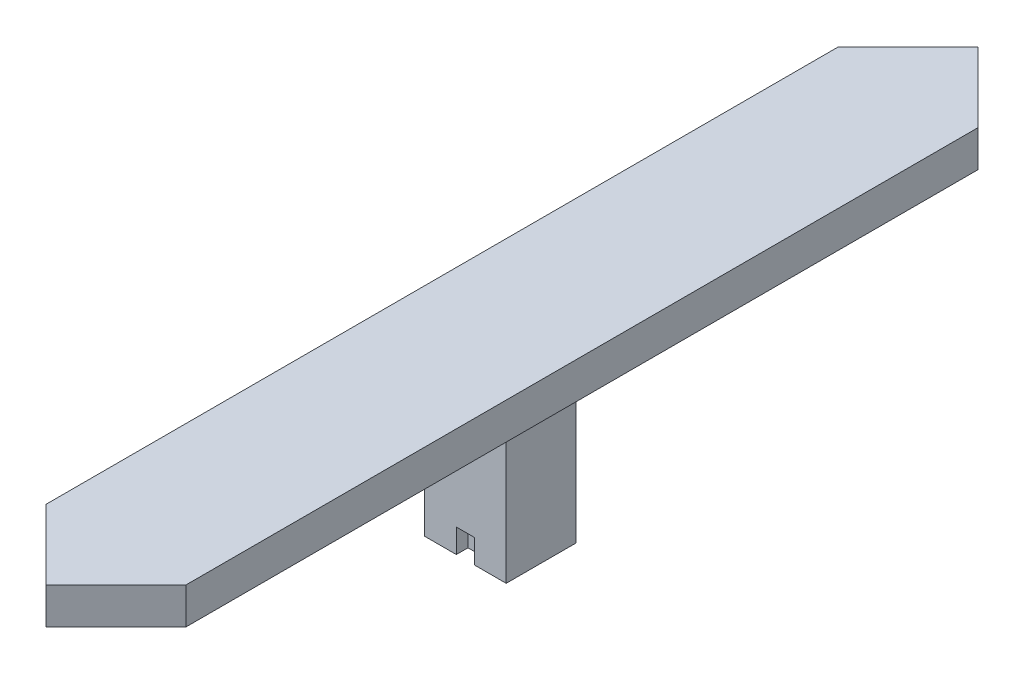
ISO-10303-21;
HEADER;
FILE_DESCRIPTION(('STEP AP214'),'2;1');
FILE_NAME('part.step','',(''),(''),'','','');
FILE_SCHEMA(('AUTOMOTIVE_DESIGN { 1 0 10303 214 1 1 1 1 }'));
ENDSEC;
DATA;
#1=APPLICATION_CONTEXT('core data for automotive mechanical design processes');
#2=APPLICATION_PROTOCOL_DEFINITION('international standard','automotive_design',2000,#1);
#3=PRODUCT_CONTEXT('',#1,'mechanical');
#4=PRODUCT('Part','Part','',(#3));
#5=PRODUCT_RELATED_PRODUCT_CATEGORY('part','',(#4));
#6=PRODUCT_DEFINITION_FORMATION('','',#4);
#7=PRODUCT_DEFINITION_CONTEXT('part definition',#1,'design');
#8=PRODUCT_DEFINITION('design','',#6,#7);
#9=PRODUCT_DEFINITION_SHAPE('','',#8);
#10=(LENGTH_UNIT() NAMED_UNIT(*) SI_UNIT(.MILLI.,.METRE.));
#11=(NAMED_UNIT(*) PLANE_ANGLE_UNIT() SI_UNIT($,.RADIAN.));
#12=(NAMED_UNIT(*) SI_UNIT($,.STERADIAN.) SOLID_ANGLE_UNIT());
#13=UNCERTAINTY_MEASURE_WITH_UNIT(LENGTH_MEASURE(1.E-05),#10,'distance_accuracy_value','');
#14=(GEOMETRIC_REPRESENTATION_CONTEXT(3) GLOBAL_UNCERTAINTY_ASSIGNED_CONTEXT((#13)) GLOBAL_UNIT_ASSIGNED_CONTEXT((#10,
#11,#12)) REPRESENTATION_CONTEXT('',''));
#15=CARTESIAN_POINT('',(0.,0.,0.));
#16=DIRECTION('',(0.,0.,1.));
#17=DIRECTION('',(1.,0.,0.));
#18=AXIS2_PLACEMENT_3D('',#15,#16,#17);
#19=CARTESIAN_POINT('',(0.,0.,0.));
#20=DIRECTION('',(0.,1.,0.));
#21=DIRECTION('',(0.,0.,1.));
#22=AXIS2_PLACEMENT_3D('',#19,#20,#21);
#23=PLANE('',#22);
#24=DIRECTION('',(-0.70710678118655,0.,0.707106781186545));
#25=VECTOR('',#24,1.);
#26=CARTESIAN_POINT('',(0.,0.,0.));
#27=LINE('',#26,#25);
#28=CARTESIAN_POINT('',(0.,0.,0.));
#29=VERTEX_POINT('',#28);
#30=CARTESIAN_POINT('',(-6.,0.,5.99999999999997));
#31=VERTEX_POINT('',#30);
#32=EDGE_CURVE('E246',#29,#31,#27,.T.);
#33=ORIENTED_EDGE('',*,*,#32,.F.);
#34=DIRECTION('',(-0.707106781186549,0.,-0.707106781186546));
#35=VECTOR('',#34,1.);
#36=CARTESIAN_POINT('',(0.,0.,0.));
#37=LINE('',#36,#35);
#38=CARTESIAN_POINT('',(6.,0.,5.99999999999996));
#39=VERTEX_POINT('',#38);
#40=EDGE_CURVE('E251',#39,#29,#37,.T.);
#41=ORIENTED_EDGE('',*,*,#40,.F.);
#42=DIRECTION('',(0.,0.,-1.));
#43=VECTOR('',#42,1.);
#44=CARTESIAN_POINT('',(6.,0.,5.99999999999996));
#45=LINE('',#44,#43);
#46=CARTESIAN_POINT('',(6.00000000000001,0.,74.));
#47=VERTEX_POINT('',#46);
#48=EDGE_CURVE('E270',#47,#39,#45,.T.);
#49=ORIENTED_EDGE('',*,*,#48,.F.);
#50=DIRECTION('',(0.70710678118655,0.,-0.707106781186545));
#51=VECTOR('',#50,1.);
#52=CARTESIAN_POINT('',(6.00000000000001,0.,74.));
#53=LINE('',#52,#51);
#54=CARTESIAN_POINT('',(0.,0.,79.9999999999999));
#55=VERTEX_POINT('',#54);
#56=EDGE_CURVE('E268',#55,#47,#53,.T.);
#57=ORIENTED_EDGE('',*,*,#56,.F.);
#58=DIRECTION('',(0.70710678118655,0.,0.707106781186545));
#59=VECTOR('',#58,1.);
#60=CARTESIAN_POINT('',(-5.99999999999999,0.,74.));
#61=LINE('',#60,#59);
#62=CARTESIAN_POINT('',(-5.99999999999999,0.,74.));
#63=VERTEX_POINT('',#62);
#64=EDGE_CURVE('E266',#63,#55,#61,.T.);
#65=ORIENTED_EDGE('',*,*,#64,.F.);
#66=DIRECTION('',(0.,0.,1.));
#67=VECTOR('',#66,1.);
#68=CARTESIAN_POINT('',(-6.,0.,5.99999999999997));
#69=LINE('',#68,#67);
#70=EDGE_CURVE('E264',#31,#63,#69,.T.);
#71=ORIENTED_EDGE('',*,*,#70,.F.);
#72=EDGE_LOOP('',(#33,#41,#49,#57,#65,#71));
#73=FACE_BOUND('',#72,.T.);
#74=DIRECTION('',(-1.,0.,0.));
#75=VECTOR('',#74,1.);
#76=CARTESIAN_POINT('',(3.49999999999999,0.,44.));
#77=LINE('',#76,#75);
#78=CARTESIAN_POINT('',(3.49999999999999,0.,44.));
#79=VERTEX_POINT('',#78);
#80=CARTESIAN_POINT('',(-3.50000000000001,0.,44.));
#81=VERTEX_POINT('',#80);
#82=EDGE_CURVE('E192',#79,#81,#77,.T.);
#83=ORIENTED_EDGE('',*,*,#82,.F.);
#84=DIRECTION('',(0.,0.,1.));
#85=VECTOR('',#84,1.);
#86=CARTESIAN_POINT('',(3.49999999999999,0.,38.));
#87=LINE('',#86,#85);
#88=CARTESIAN_POINT('',(3.49999999999999,0.,38.));
#89=VERTEX_POINT('',#88);
#90=EDGE_CURVE('E229',#89,#79,#87,.T.);
#91=ORIENTED_EDGE('',*,*,#90,.F.);
#92=DIRECTION('',(1.,0.,0.));
#93=VECTOR('',#92,1.);
#94=CARTESIAN_POINT('',(3.49999999999999,0.,38.));
#95=LINE('',#94,#93);
#96=CARTESIAN_POINT('',(-3.50000000000001,0.,38.));
#97=VERTEX_POINT('',#96);
#98=EDGE_CURVE('E237',#97,#89,#95,.T.);
#99=ORIENTED_EDGE('',*,*,#98,.F.);
#100=DIRECTION('',(0.,0.,-1.));
#101=VECTOR('',#100,1.);
#102=CARTESIAN_POINT('',(-3.50000000000001,0.,38.));
#103=LINE('',#102,#101);
#104=EDGE_CURVE('E222',#81,#97,#103,.T.);
#105=ORIENTED_EDGE('',*,*,#104,.F.);
#106=EDGE_LOOP('',(#83,#91,#99,#105));
#107=FACE_BOUND('',#106,.T.);
#108=ADVANCED_FACE('F33',(#73,#107),#23,.F.);
#109=CARTESIAN_POINT('',(0.,3.125,0.));
#110=DIRECTION('',(0.707106781186545,0.,0.70710678118655));
#111=DIRECTION('',(0.70710678118655,0.,-0.707106781186545));
#112=AXIS2_PLACEMENT_3D('',#109,#110,#111);
#113=PLANE('',#112);
#114=ORIENTED_EDGE('',*,*,#32,.T.);
#115=DIRECTION('',(0.,-1.,0.));
#116=VECTOR('',#115,1.);
#117=CARTESIAN_POINT('',(-6.,3.125,5.99999999999997));
#118=LINE('',#117,#116);
#119=CARTESIAN_POINT('',(-6.,3.125,5.99999999999997));
#120=VERTEX_POINT('',#119);
#121=EDGE_CURVE('E287',#120,#31,#118,.T.);
#122=ORIENTED_EDGE('',*,*,#121,.F.);
#123=DIRECTION('',(-0.70710678118655,0.,0.707106781186545));
#124=VECTOR('',#123,1.);
#125=CARTESIAN_POINT('',(0.,3.125,0.));
#126=LINE('',#125,#124);
#127=CARTESIAN_POINT('',(0.,3.125,0.));
#128=VERTEX_POINT('',#127);
#129=EDGE_CURVE('E247',#128,#120,#126,.T.);
#130=ORIENTED_EDGE('',*,*,#129,.F.);
#131=DIRECTION('',(0.,-1.,0.));
#132=VECTOR('',#131,1.);
#133=CARTESIAN_POINT('',(0.,3.125,0.));
#134=LINE('',#133,#132);
#135=EDGE_CURVE('E261',#128,#29,#134,.T.);
#136=ORIENTED_EDGE('',*,*,#135,.T.);
#137=EDGE_LOOP('',(#114,#122,#130,#136));
#138=FACE_BOUND('',#137,.T.);
#139=ADVANCED_FACE('F35',(#138),#113,.F.);
#140=CARTESIAN_POINT('',(-6.,3.125,5.99999999999997));
#141=DIRECTION('',(1.,0.,0.));
#142=DIRECTION('',(0.,0.,-1.));
#143=AXIS2_PLACEMENT_3D('',#140,#141,#142);
#144=PLANE('',#143);
#145=ORIENTED_EDGE('',*,*,#70,.T.);
#146=DIRECTION('',(0.,-1.,0.));
#147=VECTOR('',#146,1.);
#148=CARTESIAN_POINT('',(-5.99999999999999,3.125,74.));
#149=LINE('',#148,#147);
#150=CARTESIAN_POINT('',(-5.99999999999999,3.125,74.));
#151=VERTEX_POINT('',#150);
#152=EDGE_CURVE('E284',#151,#63,#149,.T.);
#153=ORIENTED_EDGE('',*,*,#152,.F.);
#154=DIRECTION('',(0.,0.,1.));
#155=VECTOR('',#154,1.);
#156=CARTESIAN_POINT('',(-6.,3.125,5.99999999999997));
#157=LINE('',#156,#155);
#158=EDGE_CURVE('E250',#120,#151,#157,.T.);
#159=ORIENTED_EDGE('',*,*,#158,.F.);
#160=ORIENTED_EDGE('',*,*,#121,.T.);
#161=EDGE_LOOP('',(#145,#153,#159,#160));
#162=FACE_BOUND('',#161,.T.);
#163=ADVANCED_FACE('F335',(#162),#144,.F.);
#164=CARTESIAN_POINT('',(-5.99999999999999,3.125,74.));
#165=DIRECTION('',(0.707106781186545,0.,-0.70710678118655));
#166=DIRECTION('',(-0.70710678118655,0.,-0.707106781186545));
#167=AXIS2_PLACEMENT_3D('',#164,#165,#166);
#168=PLANE('',#167);
#169=ORIENTED_EDGE('',*,*,#64,.T.);
#170=DIRECTION('',(0.,-1.,0.));
#171=VECTOR('',#170,1.);
#172=CARTESIAN_POINT('',(0.,3.125,79.9999999999999));
#173=LINE('',#172,#171);
#174=CARTESIAN_POINT('',(0.,3.125,79.9999999999999));
#175=VERTEX_POINT('',#174);
#176=EDGE_CURVE('E281',#175,#55,#173,.T.);
#177=ORIENTED_EDGE('',*,*,#176,.F.);
#178=DIRECTION('',(0.70710678118655,0.,0.707106781186545));
#179=VECTOR('',#178,1.);
#180=CARTESIAN_POINT('',(-5.99999999999999,3.125,74.));
#181=LINE('',#180,#179);
#182=EDGE_CURVE('E253',#151,#175,#181,.T.);
#183=ORIENTED_EDGE('',*,*,#182,.F.);
#184=ORIENTED_EDGE('',*,*,#152,.T.);
#185=EDGE_LOOP('',(#169,#177,#183,#184));
#186=FACE_BOUND('',#185,.T.);
#187=ADVANCED_FACE('F353',(#186),#168,.F.);
#188=CARTESIAN_POINT('',(6.00000000000001,3.125,74.));
#189=DIRECTION('',(-0.707106781186545,0.,-0.70710678118655));
#190=DIRECTION('',(-0.70710678118655,0.,0.707106781186545));
#191=AXIS2_PLACEMENT_3D('',#188,#189,#190);
#192=PLANE('',#191);
#193=ORIENTED_EDGE('',*,*,#56,.T.);
#194=DIRECTION('',(0.,-1.,0.));
#195=VECTOR('',#194,1.);
#196=CARTESIAN_POINT('',(6.00000000000001,3.125,74.));
#197=LINE('',#196,#195);
#198=CARTESIAN_POINT('',(6.00000000000001,3.125,74.));
#199=VERTEX_POINT('',#198);
#200=EDGE_CURVE('E278',#199,#47,#197,.T.);
#201=ORIENTED_EDGE('',*,*,#200,.F.);
#202=DIRECTION('',(0.70710678118655,0.,-0.707106781186545));
#203=VECTOR('',#202,1.);
#204=CARTESIAN_POINT('',(6.00000000000001,3.125,74.));
#205=LINE('',#204,#203);
#206=EDGE_CURVE('E255',#175,#199,#205,.T.);
#207=ORIENTED_EDGE('',*,*,#206,.F.);
#208=ORIENTED_EDGE('',*,*,#176,.T.);
#209=EDGE_LOOP('',(#193,#201,#207,#208));
#210=FACE_BOUND('',#209,.T.);
#211=ADVANCED_FACE('F349',(#210),#192,.F.);
#212=CARTESIAN_POINT('',(6.,3.125,5.99999999999996));
#213=DIRECTION('',(-1.,0.,0.));
#214=DIRECTION('',(0.,0.,1.));
#215=AXIS2_PLACEMENT_3D('',#212,#213,#214);
#216=PLANE('',#215);
#217=ORIENTED_EDGE('',*,*,#48,.T.);
#218=DIRECTION('',(0.,-1.,0.));
#219=VECTOR('',#218,1.);
#220=CARTESIAN_POINT('',(6.,3.125,5.99999999999996));
#221=LINE('',#220,#219);
#222=CARTESIAN_POINT('',(6.,3.125,5.99999999999996));
#223=VERTEX_POINT('',#222);
#224=EDGE_CURVE('E275',#223,#39,#221,.T.);
#225=ORIENTED_EDGE('',*,*,#224,.F.);
#226=DIRECTION('',(0.,0.,-1.));
#227=VECTOR('',#226,1.);
#228=CARTESIAN_POINT('',(6.,3.125,5.99999999999996));
#229=LINE('',#228,#227);
#230=EDGE_CURVE('E257',#199,#223,#229,.T.);
#231=ORIENTED_EDGE('',*,*,#230,.F.);
#232=ORIENTED_EDGE('',*,*,#200,.T.);
#233=EDGE_LOOP('',(#217,#225,#231,#232));
#234=FACE_BOUND('',#233,.T.);
#235=ADVANCED_FACE('F345',(#234),#216,.F.);
#236=CARTESIAN_POINT('',(0.,3.125,0.));
#237=DIRECTION('',(-0.707106781186546,0.,0.707106781186549));
#238=DIRECTION('',(0.707106781186549,0.,0.707106781186546));
#239=AXIS2_PLACEMENT_3D('',#236,#237,#238);
#240=PLANE('',#239);
#241=ORIENTED_EDGE('',*,*,#40,.T.);
#242=ORIENTED_EDGE('',*,*,#135,.F.);
#243=DIRECTION('',(-0.707106781186549,0.,-0.707106781186546));
#244=VECTOR('',#243,1.);
#245=CARTESIAN_POINT('',(0.,3.125,0.));
#246=LINE('',#245,#244);
#247=EDGE_CURVE('E259',#223,#128,#246,.T.);
#248=ORIENTED_EDGE('',*,*,#247,.F.);
#249=ORIENTED_EDGE('',*,*,#224,.T.);
#250=EDGE_LOOP('',(#241,#242,#248,#249));
#251=FACE_BOUND('',#250,.T.);
#252=ADVANCED_FACE('F342',(#251),#240,.F.);
#253=CARTESIAN_POINT('',(0.,3.125,0.));
#254=DIRECTION('',(0.,1.,0.));
#255=DIRECTION('',(0.,0.,1.));
#256=AXIS2_PLACEMENT_3D('',#253,#254,#255);
#257=PLANE('',#256);
#258=ORIENTED_EDGE('',*,*,#129,.T.);
#259=ORIENTED_EDGE('',*,*,#158,.T.);
#260=ORIENTED_EDGE('',*,*,#182,.T.);
#261=ORIENTED_EDGE('',*,*,#206,.T.);
#262=ORIENTED_EDGE('',*,*,#230,.T.);
#263=ORIENTED_EDGE('',*,*,#247,.T.);
#264=EDGE_LOOP('',(#258,#259,#260,#261,#262,#263));
#265=FACE_BOUND('',#264,.T.);
#266=ADVANCED_FACE('F340',(#265),#257,.T.);
#267=CARTESIAN_POINT('',(-3.50000000000001,-13.,38.));
#268=DIRECTION('',(1.,0.,0.));
#269=DIRECTION('',(0.,0.,-1.));
#270=AXIS2_PLACEMENT_3D('',#267,#268,#269);
#271=PLANE('',#270);
#272=ORIENTED_EDGE('',*,*,#104,.T.);
#273=DIRECTION('',(0.,1.,0.));
#274=VECTOR('',#273,1.);
#275=CARTESIAN_POINT('',(-3.50000000000001,-13.,38.));
#276=LINE('',#275,#274);
#277=CARTESIAN_POINT('',(-3.50000000000001,-13.,38.));
#278=VERTEX_POINT('',#277);
#279=EDGE_CURVE('E243',#278,#97,#276,.T.);
#280=ORIENTED_EDGE('',*,*,#279,.F.);
#281=DIRECTION('',(0.,0.,-1.));
#282=VECTOR('',#281,1.);
#283=CARTESIAN_POINT('',(-3.50000000000001,-13.,38.));
#284=LINE('',#283,#282);
#285=CARTESIAN_POINT('',(-3.50000000000001,-13.,44.));
#286=VERTEX_POINT('',#285);
#287=EDGE_CURVE('E225',#286,#278,#284,.T.);
#288=ORIENTED_EDGE('',*,*,#287,.F.);
#289=DIRECTION('',(0.,-1.,0.));
#290=VECTOR('',#289,1.);
#291=CARTESIAN_POINT('',(-3.50000000000001,0.,44.));
#292=LINE('',#291,#290);
#293=EDGE_CURVE('E195',#81,#286,#292,.T.);
#294=ORIENTED_EDGE('',*,*,#293,.F.);
#295=EDGE_LOOP('',(#272,#280,#288,#294));
#296=FACE_BOUND('',#295,.T.);
#297=ADVANCED_FACE('F315',(#296),#271,.F.);
#298=CARTESIAN_POINT('',(3.49999999999999,-13.,38.));
#299=DIRECTION('',(0.,0.,1.));
#300=DIRECTION('',(1.,0.,0.));
#301=AXIS2_PLACEMENT_3D('',#298,#299,#300);
#302=PLANE('',#301);
#303=ORIENTED_EDGE('',*,*,#98,.T.);
#304=DIRECTION('',(0.,1.,0.));
#305=VECTOR('',#304,1.);
#306=CARTESIAN_POINT('',(3.49999999999999,-13.,38.));
#307=LINE('',#306,#305);
#308=CARTESIAN_POINT('',(3.49999999999999,-13.,38.));
#309=VERTEX_POINT('',#308);
#310=EDGE_CURVE('E234',#309,#89,#307,.T.);
#311=ORIENTED_EDGE('',*,*,#310,.F.);
#312=DIRECTION('',(1.,0.,0.));
#313=VECTOR('',#312,1.);
#314=CARTESIAN_POINT('',(3.49999999999999,-13.,38.));
#315=LINE('',#314,#313);
#316=EDGE_CURVE('E228',#278,#309,#315,.T.);
#317=ORIENTED_EDGE('',*,*,#316,.F.);
#318=ORIENTED_EDGE('',*,*,#279,.T.);
#319=EDGE_LOOP('',(#303,#311,#317,#318));
#320=FACE_BOUND('',#319,.T.);
#321=ADVANCED_FACE('F381',(#320),#302,.F.);
#322=CARTESIAN_POINT('',(3.49999999999999,-13.,38.));
#323=DIRECTION('',(-1.,0.,0.));
#324=DIRECTION('',(0.,0.,1.));
#325=AXIS2_PLACEMENT_3D('',#322,#323,#324);
#326=PLANE('',#325);
#327=ORIENTED_EDGE('',*,*,#90,.T.);
#328=DIRECTION('',(0.,1.,0.));
#329=VECTOR('',#328,1.);
#330=CARTESIAN_POINT('',(3.49999999999999,0.,44.));
#331=LINE('',#330,#329);
#332=CARTESIAN_POINT('',(3.49999999999999,-13.,44.));
#333=VERTEX_POINT('',#332);
#334=EDGE_CURVE('E189',#333,#79,#331,.T.);
#335=ORIENTED_EDGE('',*,*,#334,.F.);
#336=DIRECTION('',(0.,0.,1.));
#337=VECTOR('',#336,1.);
#338=CARTESIAN_POINT('',(3.49999999999999,-13.,38.));
#339=LINE('',#338,#337);
#340=EDGE_CURVE('E231',#309,#333,#339,.T.);
#341=ORIENTED_EDGE('',*,*,#340,.F.);
#342=ORIENTED_EDGE('',*,*,#310,.T.);
#343=EDGE_LOOP('',(#327,#335,#341,#342));
#344=FACE_BOUND('',#343,.T.);
#345=ADVANCED_FACE('F309',(#344),#326,.F.);
#346=CARTESIAN_POINT('',(0.,-13.,0.));
#347=DIRECTION('',(0.,-1.,0.));
#348=DIRECTION('',(0.,0.,-1.));
#349=AXIS2_PLACEMENT_3D('',#346,#347,#348);
#350=PLANE('',#349);
#351=DIRECTION('',(0.,0.,-1.));
#352=VECTOR('',#351,1.);
#353=CARTESIAN_POINT('',(-0.778595445334318,-13.,0.));
#354=LINE('',#353,#352);
#355=CARTESIAN_POINT('',(-0.778595445334318,-13.,44.));
#356=VERTEX_POINT('',#355);
#357=CARTESIAN_POINT('',(-0.778595445334318,-13.,43.));
#358=VERTEX_POINT('',#357);
#359=EDGE_CURVE('E186',#356,#358,#354,.T.);
#360=ORIENTED_EDGE('',*,*,#359,.F.);
#361=DIRECTION('',(1.,0.,0.));
#362=VECTOR('',#361,1.);
#363=CARTESIAN_POINT('',(3.49999999999999,-13.,44.));
#364=LINE('',#363,#362);
#365=EDGE_CURVE('E199',#286,#356,#364,.T.);
#366=ORIENTED_EDGE('',*,*,#365,.F.);
#367=ORIENTED_EDGE('',*,*,#287,.T.);
#368=ORIENTED_EDGE('',*,*,#316,.T.);
#369=ORIENTED_EDGE('',*,*,#340,.T.);
#370=CARTESIAN_POINT('',(0.778595445334302,-13.,44.));
#371=VERTEX_POINT('',#370);
#372=EDGE_CURVE('E198',#371,#333,#364,.T.);
#373=ORIENTED_EDGE('',*,*,#372,.F.);
#374=DIRECTION('',(0.,0.,1.));
#375=VECTOR('',#374,1.);
#376=CARTESIAN_POINT('',(0.778595445334302,-13.,0.));
#377=LINE('',#376,#375);
#378=CARTESIAN_POINT('',(0.778595445334302,-13.,43.));
#379=VERTEX_POINT('',#378);
#380=EDGE_CURVE('E48',#379,#371,#377,.T.);
#381=ORIENTED_EDGE('',*,*,#380,.F.);
#382=DIRECTION('',(-1.,0.,0.));
#383=VECTOR('',#382,1.);
#384=CARTESIAN_POINT('',(0.,-13.,43.));
#385=LINE('',#384,#383);
#386=EDGE_CURVE('E11',#379,#358,#385,.T.);
#387=ORIENTED_EDGE('',*,*,#386,.T.);
#388=EDGE_LOOP('',(#360,#366,#367,#368,#369,#373,#381,#387));
#389=FACE_BOUND('',#388,.T.);
#390=DIRECTION('',(0.,0.,1.));
#391=VECTOR('',#390,1.);
#392=CARTESIAN_POINT('',(3.32685810810811,-13.,0.));
#393=LINE('',#392,#391);
#394=CARTESIAN_POINT('',(3.32685810810811,-13.,39.5));
#395=VERTEX_POINT('',#394);
#396=CARTESIAN_POINT('',(3.32685810810811,-13.,42.));
#397=VERTEX_POINT('',#396);
#398=EDGE_CURVE('E295',#395,#397,#393,.T.);
#399=ORIENTED_EDGE('',*,*,#398,.F.);
#400=DIRECTION('',(-1.,0.,0.));
#401=VECTOR('',#400,1.);
#402=CARTESIAN_POINT('',(0.,-13.,39.5));
#403=LINE('',#402,#401);
#404=CARTESIAN_POINT('',(-3.32685810810811,-13.,39.5));
#405=VERTEX_POINT('',#404);
#406=EDGE_CURVE('E290',#395,#405,#403,.T.);
#407=ORIENTED_EDGE('',*,*,#406,.T.);
#408=DIRECTION('',(0.,0.,-1.));
#409=VECTOR('',#408,1.);
#410=CARTESIAN_POINT('',(-3.32685810810811,-13.,0.));
#411=LINE('',#410,#409);
#412=CARTESIAN_POINT('',(-3.32685810810811,-13.,42.));
#413=VERTEX_POINT('',#412);
#414=EDGE_CURVE('E293',#413,#405,#411,.T.);
#415=ORIENTED_EDGE('',*,*,#414,.F.);
#416=DIRECTION('',(1.,0.,0.));
#417=VECTOR('',#416,1.);
#418=CARTESIAN_POINT('',(3.49999999999999,-13.,42.));
#419=LINE('',#418,#417);
#420=EDGE_CURVE('E188',#413,#397,#419,.T.);
#421=ORIENTED_EDGE('',*,*,#420,.T.);
#422=EDGE_LOOP('',(#399,#407,#415,#421));
#423=FACE_BOUND('',#422,.T.);
#424=ADVANCED_FACE('F303',(#389,#423),#350,.T.);
#425=CARTESIAN_POINT('',(2.25,-2.8,39.5));
#426=DIRECTION('',(0.99447318946185,0.104990835036091,0.));
#427=DIRECTION('',(-0.104990835036091,0.99447318946185,0.));
#428=AXIS2_PLACEMENT_3D('',#425,#426,#427);
#429=PLANE('',#428);
#430=ORIENTED_EDGE('',*,*,#398,.T.);
#431=DIRECTION('',(-0.104990835036091,0.99447318946185,0.));
#432=VECTOR('',#431,1.);
#433=CARTESIAN_POINT('',(2.25,-2.8,42.));
#434=LINE('',#433,#432);
#435=CARTESIAN_POINT('',(2.25,-2.8,42.));
#436=VERTEX_POINT('',#435);
#437=EDGE_CURVE('E202',#397,#436,#434,.T.);
#438=ORIENTED_EDGE('',*,*,#437,.T.);
#439=DIRECTION('',(0.,0.,1.));
#440=VECTOR('',#439,1.);
#441=CARTESIAN_POINT('',(2.25,-2.8,39.5));
#442=LINE('',#441,#440);
#443=CARTESIAN_POINT('',(2.25,-2.8,39.5));
#444=VERTEX_POINT('',#443);
#445=EDGE_CURVE('E211',#444,#436,#442,.T.);
#446=ORIENTED_EDGE('',*,*,#445,.F.);
#447=DIRECTION('',(-0.104990835036091,0.99447318946185,0.));
#448=VECTOR('',#447,1.);
#449=CARTESIAN_POINT('',(2.25,-2.8,39.5));
#450=LINE('',#449,#448);
#451=EDGE_CURVE('E205',#395,#444,#450,.T.);
#452=ORIENTED_EDGE('',*,*,#451,.F.);
#453=EDGE_LOOP('',(#430,#438,#446,#452));
#454=FACE_BOUND('',#453,.T.);
#455=ADVANCED_FACE('F392',(#454),#429,.F.);
#456=CARTESIAN_POINT('',(-2.25,-2.8,39.5));
#457=DIRECTION('',(-0.99447318946185,0.104990835036091,0.));
#458=DIRECTION('',(-0.104990835036091,-0.99447318946185,0.));
#459=AXIS2_PLACEMENT_3D('',#456,#457,#458);
#460=PLANE('',#459);
#461=ORIENTED_EDGE('',*,*,#414,.T.);
#462=DIRECTION('',(-0.104990835036091,-0.99447318946185,0.));
#463=VECTOR('',#462,1.);
#464=CARTESIAN_POINT('',(-2.25,-2.8,39.5));
#465=LINE('',#464,#463);
#466=CARTESIAN_POINT('',(-2.25,-2.8,39.5));
#467=VERTEX_POINT('',#466);
#468=EDGE_CURVE('E56',#467,#405,#465,.T.);
#469=ORIENTED_EDGE('',*,*,#468,.F.);
#470=DIRECTION('',(0.,0.,1.));
#471=VECTOR('',#470,1.);
#472=CARTESIAN_POINT('',(-2.25,-2.8,39.5));
#473=LINE('',#472,#471);
#474=CARTESIAN_POINT('',(-2.25,-2.8,42.));
#475=VERTEX_POINT('',#474);
#476=EDGE_CURVE('E219',#467,#475,#473,.T.);
#477=ORIENTED_EDGE('',*,*,#476,.T.);
#478=DIRECTION('',(-0.104990835036091,-0.99447318946185,0.));
#479=VECTOR('',#478,1.);
#480=CARTESIAN_POINT('',(-2.25,-2.8,42.));
#481=LINE('',#480,#479);
#482=EDGE_CURVE('E208',#475,#413,#481,.T.);
#483=ORIENTED_EDGE('',*,*,#482,.T.);
#484=EDGE_LOOP('',(#461,#469,#477,#483));
#485=FACE_BOUND('',#484,.T.);
#486=ADVANCED_FACE('F395',(#485),#460,.F.);
#487=CARTESIAN_POINT('',(0.,-2.8,39.5));
#488=DIRECTION('',(0.,0.,1.));
#489=DIRECTION('',(1.,0.,0.));
#490=AXIS2_PLACEMENT_3D('',#487,#488,#489);
#491=CYLINDRICAL_SURFACE('',#490,2.25);
#492=CARTESIAN_POINT('',(0.,-2.8,42.));
#493=DIRECTION('',(0.,0.,1.));
#494=DIRECTION('',(1.,0.,0.));
#495=AXIS2_PLACEMENT_3D('',#492,#493,#494);
#496=CIRCLE('',#495,2.25);
#497=EDGE_CURVE('E214',#436,#475,#496,.T.);
#498=ORIENTED_EDGE('',*,*,#497,.T.);
#499=ORIENTED_EDGE('',*,*,#476,.F.);
#500=CARTESIAN_POINT('',(0.,-2.8,39.5));
#501=DIRECTION('',(0.,0.,1.));
#502=DIRECTION('',(1.,0.,0.));
#503=AXIS2_PLACEMENT_3D('',#500,#501,#502);
#504=CIRCLE('',#503,2.25);
#505=EDGE_CURVE('E207',#444,#467,#504,.T.);
#506=ORIENTED_EDGE('',*,*,#505,.F.);
#507=ORIENTED_EDGE('',*,*,#445,.T.);
#508=EDGE_LOOP('',(#498,#499,#506,#507));
#509=FACE_BOUND('',#508,.T.);
#510=ADVANCED_FACE('F397',(#509),#491,.F.);
#511=CARTESIAN_POINT('',(0.,-2.8,39.5));
#512=DIRECTION('',(0.,0.,1.));
#513=DIRECTION('',(1.,0.,0.));
#514=AXIS2_PLACEMENT_3D('',#511,#512,#513);
#515=PLANE('',#514);
#516=ORIENTED_EDGE('',*,*,#451,.T.);
#517=ORIENTED_EDGE('',*,*,#505,.T.);
#518=ORIENTED_EDGE('',*,*,#468,.T.);
#519=ORIENTED_EDGE('',*,*,#406,.F.);
#520=EDGE_LOOP('',(#516,#517,#518,#519));
#521=FACE_BOUND('',#520,.T.);
#522=ADVANCED_FACE('F400',(#521),#515,.T.);
#523=CARTESIAN_POINT('',(0.,0.,42.));
#524=DIRECTION('',(0.,0.,-1.));
#525=DIRECTION('',(-1.,0.,0.));
#526=AXIS2_PLACEMENT_3D('',#523,#524,#525);
#527=PLANE('',#526);
#528=ORIENTED_EDGE('',*,*,#437,.F.);
#529=ORIENTED_EDGE('',*,*,#420,.F.);
#530=ORIENTED_EDGE('',*,*,#482,.F.);
#531=ORIENTED_EDGE('',*,*,#497,.F.);
#532=EDGE_LOOP('',(#528,#529,#530,#531));
#533=FACE_BOUND('',#532,.T.);
#534=ADVANCED_FACE('F326',(#533),#527,.T.);
#535=CARTESIAN_POINT('',(0.,0.,44.));
#536=DIRECTION('',(0.,0.,-1.));
#537=DIRECTION('',(-1.,0.,0.));
#538=AXIS2_PLACEMENT_3D('',#535,#536,#537);
#539=PLANE('',#538);
#540=ORIENTED_EDGE('',*,*,#365,.T.);
#541=DIRECTION('',(0.,-1.,0.));
#542=VECTOR('',#541,1.);
#543=CARTESIAN_POINT('',(-0.778595445334318,-15.0495690158332,44.));
#544=LINE('',#543,#542);
#545=CARTESIAN_POINT('',(-0.778595445334318,-10.9504309841668,44.));
#546=VERTEX_POINT('',#545);
#547=EDGE_CURVE('E180',#546,#356,#544,.T.);
#548=ORIENTED_EDGE('',*,*,#547,.F.);
#549=DIRECTION('',(-1.,0.,0.));
#550=VECTOR('',#549,1.);
#551=CARTESIAN_POINT('',(0.778595445334302,-10.9504309841668,44.));
#552=LINE('',#551,#550);
#553=CARTESIAN_POINT('',(0.778595445334302,-10.9504309841668,44.));
#554=VERTEX_POINT('',#553);
#555=EDGE_CURVE('E182',#554,#546,#552,.T.);
#556=ORIENTED_EDGE('',*,*,#555,.F.);
#557=DIRECTION('',(0.,-1.,0.));
#558=VECTOR('',#557,1.);
#559=CARTESIAN_POINT('',(0.778595445334302,0.,44.));
#560=LINE('',#559,#558);
#561=EDGE_CURVE('E41',#554,#371,#560,.T.);
#562=ORIENTED_EDGE('',*,*,#561,.T.);
#563=ORIENTED_EDGE('',*,*,#372,.T.);
#564=ORIENTED_EDGE('',*,*,#334,.T.);
#565=ORIENTED_EDGE('',*,*,#82,.T.);
#566=ORIENTED_EDGE('',*,*,#293,.T.);
#567=EDGE_LOOP('',(#540,#548,#556,#562,#563,#564,#565,#566));
#568=FACE_BOUND('',#567,.T.);
#569=ADVANCED_FACE('F299',(#568),#539,.F.);
#570=CARTESIAN_POINT('',(-0.778595445334318,-15.0495690158332,43.));
#571=DIRECTION('',(-1.,0.,0.));
#572=DIRECTION('',(0.,0.,1.));
#573=AXIS2_PLACEMENT_3D('',#570,#571,#572);
#574=PLANE('',#573);
#575=ORIENTED_EDGE('',*,*,#359,.T.);
#576=DIRECTION('',(0.,-1.,0.));
#577=VECTOR('',#576,1.);
#578=CARTESIAN_POINT('',(-0.778595445334318,-15.0495690158332,43.));
#579=LINE('',#578,#577);
#580=CARTESIAN_POINT('',(-0.778595445334318,-10.9504309841668,43.));
#581=VERTEX_POINT('',#580);
#582=EDGE_CURVE('E165',#581,#358,#579,.T.);
#583=ORIENTED_EDGE('',*,*,#582,.F.);
#584=DIRECTION('',(0.,0.,1.));
#585=VECTOR('',#584,1.);
#586=CARTESIAN_POINT('',(-0.778595445334318,-10.9504309841668,43.));
#587=LINE('',#586,#585);
#588=EDGE_CURVE('E173',#581,#546,#587,.T.);
#589=ORIENTED_EDGE('',*,*,#588,.T.);
#590=ORIENTED_EDGE('',*,*,#547,.T.);
#591=EDGE_LOOP('',(#575,#583,#589,#590));
#592=FACE_BOUND('',#591,.T.);
#593=ADVANCED_FACE('F318',(#592),#574,.F.);
#594=CARTESIAN_POINT('',(0.778595445334302,-10.9504309841668,43.));
#595=DIRECTION('',(0.,1.,0.));
#596=DIRECTION('',(0.,0.,1.));
#597=AXIS2_PLACEMENT_3D('',#594,#595,#596);
#598=PLANE('',#597);
#599=ORIENTED_EDGE('',*,*,#555,.T.);
#600=ORIENTED_EDGE('',*,*,#588,.F.);
#601=DIRECTION('',(-1.,0.,0.));
#602=VECTOR('',#601,1.);
#603=CARTESIAN_POINT('',(0.778595445334302,-10.9504309841668,43.));
#604=LINE('',#603,#602);
#605=CARTESIAN_POINT('',(0.778595445334302,-10.9504309841668,43.));
#606=VERTEX_POINT('',#605);
#607=EDGE_CURVE('E164',#606,#581,#604,.T.);
#608=ORIENTED_EDGE('',*,*,#607,.F.);
#609=DIRECTION('',(0.,0.,1.));
#610=VECTOR('',#609,1.);
#611=CARTESIAN_POINT('',(0.778595445334302,-10.9504309841668,43.));
#612=LINE('',#611,#610);
#613=EDGE_CURVE('E168',#606,#554,#612,.T.);
#614=ORIENTED_EDGE('',*,*,#613,.T.);
#615=EDGE_LOOP('',(#599,#600,#608,#614));
#616=FACE_BOUND('',#615,.T.);
#617=ADVANCED_FACE('F175',(#616),#598,.F.);
#618=CARTESIAN_POINT('',(0.778595445334302,-15.0495690158332,43.));
#619=DIRECTION('',(1.,0.,0.));
#620=DIRECTION('',(0.,0.,-1.));
#621=AXIS2_PLACEMENT_3D('',#618,#619,#620);
#622=PLANE('',#621);
#623=ORIENTED_EDGE('',*,*,#380,.T.);
#624=ORIENTED_EDGE('',*,*,#561,.F.);
#625=ORIENTED_EDGE('',*,*,#613,.F.);
#626=DIRECTION('',(0.,1.,0.));
#627=VECTOR('',#626,1.);
#628=CARTESIAN_POINT('',(0.778595445334302,-15.0495690158332,43.));
#629=LINE('',#628,#627);
#630=EDGE_CURVE('E159',#379,#606,#629,.T.);
#631=ORIENTED_EDGE('',*,*,#630,.F.);
#632=EDGE_LOOP('',(#623,#624,#625,#631));
#633=FACE_BOUND('',#632,.T.);
#634=ADVANCED_FACE('F169',(#633),#622,.F.);
#635=CARTESIAN_POINT('',(0.,0.,43.));
#636=DIRECTION('',(0.,0.,1.));
#637=DIRECTION('',(1.,0.,0.));
#638=AXIS2_PLACEMENT_3D('',#635,#636,#637);
#639=PLANE('',#638);
#640=ORIENTED_EDGE('',*,*,#630,.T.);
#641=ORIENTED_EDGE('',*,*,#607,.T.);
#642=ORIENTED_EDGE('',*,*,#582,.T.);
#643=ORIENTED_EDGE('',*,*,#386,.F.);
#644=EDGE_LOOP('',(#640,#641,#642,#643));
#645=FACE_BOUND('',#644,.T.);
#646=ADVANCED_FACE('F161',(#645),#639,.T.);
#647=CLOSED_SHELL('',(#108,#139,#163,#187,#211,#235,#252,#266,#297,#321,#345,#424,#455,#486,
#510,#522,#534,#569,#593,#617,#634,#646));
#648=MANIFOLD_SOLID_BREP('B2',#647);
#649=ADVANCED_BREP_SHAPE_REPRESENTATION('',(#18,#648),#14);
#650=SHAPE_DEFINITION_REPRESENTATION(#9,#649);
ENDSEC;
END-ISO-10303-21;
